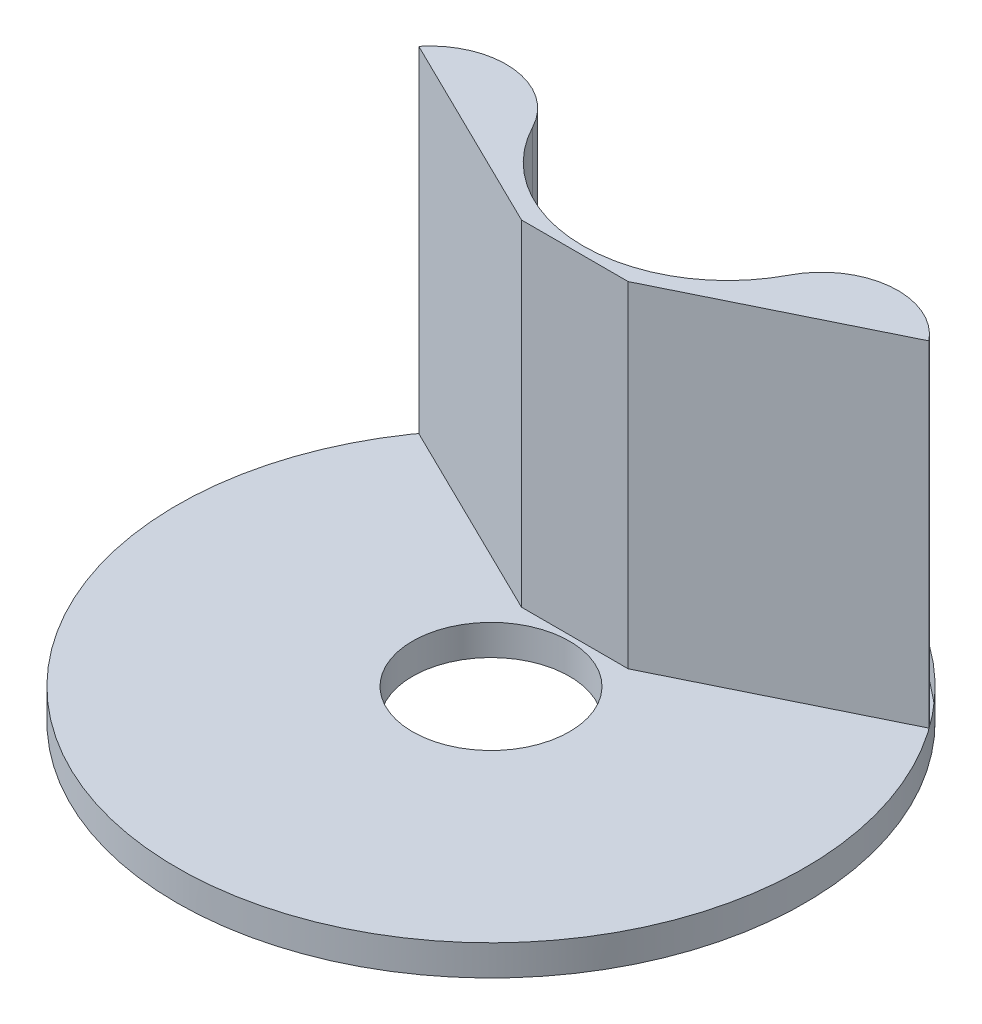
ISO-10303-21;
HEADER;
FILE_DESCRIPTION(('STEP AP214'),'2;1');
FILE_NAME('part.step','',(''),(''),'','','');
FILE_SCHEMA(('AUTOMOTIVE_DESIGN { 1 0 10303 214 1 1 1 1 }'));
ENDSEC;
DATA;
#1=APPLICATION_CONTEXT('core data for automotive mechanical design processes');
#2=APPLICATION_PROTOCOL_DEFINITION('international standard','automotive_design',2000,#1);
#3=PRODUCT_CONTEXT('',#1,'mechanical');
#4=PRODUCT('Part','Part','',(#3));
#5=PRODUCT_RELATED_PRODUCT_CATEGORY('part','',(#4));
#6=PRODUCT_DEFINITION_FORMATION('','',#4);
#7=PRODUCT_DEFINITION_CONTEXT('part definition',#1,'design');
#8=PRODUCT_DEFINITION('design','',#6,#7);
#9=PRODUCT_DEFINITION_SHAPE('','',#8);
#10=(LENGTH_UNIT() NAMED_UNIT(*) SI_UNIT(.MILLI.,.METRE.));
#11=(NAMED_UNIT(*) PLANE_ANGLE_UNIT() SI_UNIT($,.RADIAN.));
#12=(NAMED_UNIT(*) SI_UNIT($,.STERADIAN.) SOLID_ANGLE_UNIT());
#13=UNCERTAINTY_MEASURE_WITH_UNIT(LENGTH_MEASURE(1.E-05),#10,'distance_accuracy_value','');
#14=(GEOMETRIC_REPRESENTATION_CONTEXT(3) GLOBAL_UNCERTAINTY_ASSIGNED_CONTEXT((#13)) GLOBAL_UNIT_ASSIGNED_CONTEXT((#10,
#11,#12)) REPRESENTATION_CONTEXT('',''));
#15=CARTESIAN_POINT('',(0.,0.,0.));
#16=DIRECTION('',(0.,0.,1.));
#17=DIRECTION('',(1.,0.,0.));
#18=AXIS2_PLACEMENT_3D('',#15,#16,#17);
#19=CARTESIAN_POINT('',(0.,2.,0.));
#20=DIRECTION('',(0.,1.,0.));
#21=DIRECTION('',(0.,0.,1.));
#22=AXIS2_PLACEMENT_3D('',#19,#20,#21);
#23=PLANE('',#22);
#24=CARTESIAN_POINT('',(0.,2.,-13.));
#25=DIRECTION('',(0.,1.,0.));
#26=DIRECTION('',(0.,0.,1.));
#27=AXIS2_PLACEMENT_3D('',#24,#25,#26);
#28=CIRCLE('',#27,6.5);
#29=CARTESIAN_POINT('',(0.,2.,-6.5));
#30=VERTEX_POINT('',#29);
#31=EDGE_CURVE('E113',#30,#30,#28,.T.);
#32=ORIENTED_EDGE('',*,*,#31,.F.);
#33=EDGE_LOOP('',(#32));
#34=FACE_BOUND('',#33,.T.);
#35=CARTESIAN_POINT('',(0.,2.,0.));
#36=DIRECTION('',(0.,1.,0.));
#37=DIRECTION('',(0.,0.,1.));
#38=AXIS2_PLACEMENT_3D('',#35,#36,#37);
#39=CIRCLE('',#38,20.6);
#40=CARTESIAN_POINT('',(16.970524527272,2.,-11.6773840079557));
#41=VERTEX_POINT('',#40);
#42=CARTESIAN_POINT('',(-16.970524527272,2.,-11.6773840079557));
#43=VERTEX_POINT('',#42);
#44=EDGE_CURVE('E163',#41,#43,#39,.T.);
#45=ORIENTED_EDGE('',*,*,#44,.T.);
#46=CARTESIAN_POINT('',(-12.8514651759924,2.,-8.84306750117036));
#47=DIRECTION('',(0.,1.,0.));
#48=DIRECTION('',(0.,0.,1.));
#49=AXIS2_PLACEMENT_3D('',#46,#47,#48);
#50=CIRCLE('',#49,5.);
#51=CARTESIAN_POINT('',(-16.7331271257797,2.,-11.9946862134471));
#52=VERTEX_POINT('',#51);
#53=EDGE_CURVE('E179',#52,#43,#50,.T.);
#54=ORIENTED_EDGE('',*,*,#53,.F.);
#55=CARTESIAN_POINT('',(-12.8514651759924,2.,-8.84306750117036));
#56=DIRECTION('',(0.,1.,0.));
#57=DIRECTION('',(0.,0.,1.));
#58=AXIS2_PLACEMENT_3D('',#55,#56,#57);
#59=CIRCLE('',#58,5.);
#60=CARTESIAN_POINT('',(-8.41592587564528,2.,-11.1508783935696));
#61=VERTEX_POINT('',#60);
#62=EDGE_CURVE('E11',#52,#61,#59,.F.);
#63=ORIENTED_EDGE('',*,*,#62,.T.);
#64=CARTESIAN_POINT('',(0.,2.,-15.5296842366197));
#65=DIRECTION('',(0.,1.,0.));
#66=DIRECTION('',(0.,0.,1.));
#67=AXIS2_PLACEMENT_3D('',#64,#65,#66);
#68=CIRCLE('',#67,9.48692515810502);
#69=CARTESIAN_POINT('',(8.41592587564528,2.,-11.1508783935696));
#70=VERTEX_POINT('',#69);
#71=EDGE_CURVE('E134',#61,#70,#68,.T.);
#72=ORIENTED_EDGE('',*,*,#71,.T.);
#73=CARTESIAN_POINT('',(12.8514651759924,2.,-8.84306750117036));
#74=DIRECTION('',(0.,1.,0.));
#75=DIRECTION('',(0.,0.,1.));
#76=AXIS2_PLACEMENT_3D('',#73,#74,#75);
#77=CIRCLE('',#76,5.);
#78=CARTESIAN_POINT('',(16.7331271257797,2.,-11.9946862134471));
#79=VERTEX_POINT('',#78);
#80=EDGE_CURVE('E50',#70,#79,#77,.F.);
#81=ORIENTED_EDGE('',*,*,#80,.T.);
#82=CARTESIAN_POINT('',(12.8514651759924,2.,-8.84306750117036));
#83=DIRECTION('',(0.,1.,0.));
#84=DIRECTION('',(0.,0.,1.));
#85=AXIS2_PLACEMENT_3D('',#82,#83,#84);
#86=CIRCLE('',#85,5.);
#87=EDGE_CURVE('E183',#41,#79,#86,.T.);
#88=ORIENTED_EDGE('',*,*,#87,.F.);
#89=EDGE_LOOP('',(#45,#54,#63,#72,#81,#88));
#90=FACE_BOUND('',#89,.T.);
#91=ADVANCED_FACE('F41',(#34,#90),#23,.T.);
#92=CARTESIAN_POINT('',(0.,2.,0.));
#93=DIRECTION('',(0.,-1.,0.));
#94=DIRECTION('',(0.,0.,-1.));
#95=AXIS2_PLACEMENT_3D('',#92,#93,#94);
#96=CYLINDRICAL_SURFACE('',#95,20.6);
#97=ORIENTED_EDGE('',*,*,#44,.F.);
#98=EDGE_CURVE('E159',#43,#41,#39,.T.);
#99=ORIENTED_EDGE('',*,*,#98,.F.);
#100=EDGE_LOOP('',(#97,#99));
#101=FACE_BOUND('',#100,.T.);
#102=CARTESIAN_POINT('',(0.,0.,0.));
#103=DIRECTION('',(0.,1.,0.));
#104=DIRECTION('',(0.,0.,1.));
#105=AXIS2_PLACEMENT_3D('',#102,#103,#104);
#106=CIRCLE('',#105,20.6);
#107=CARTESIAN_POINT('',(0.,0.,20.6));
#108=VERTEX_POINT('',#107);
#109=EDGE_CURVE('E164',#108,#108,#106,.T.);
#110=ORIENTED_EDGE('',*,*,#109,.T.);
#111=EDGE_LOOP('',(#110));
#112=FACE_BOUND('',#111,.T.);
#113=ADVANCED_FACE('F216',(#101,#112),#96,.T.);
#114=ORIENTED_EDGE('',*,*,#98,.T.);
#115=ORIENTED_EDGE('',*,*,#87,.T.);
#116=DIRECTION('',(0.897709903987118,0.,-0.440587026912322));
#117=VECTOR('',#116,1.);
#118=CARTESIAN_POINT('',(-1.49594710795883,2.,-3.04803921274508));
#119=LINE('',#118,#117);
#120=CARTESIAN_POINT('',(3.5,2.,-5.5));
#121=VERTEX_POINT('',#120);
#122=EDGE_CURVE('E129',#121,#79,#119,.T.);
#123=ORIENTED_EDGE('',*,*,#122,.F.);
#124=DIRECTION('',(1.,0.,0.));
#125=VECTOR('',#124,1.);
#126=CARTESIAN_POINT('',(0.,2.,-5.5));
#127=LINE('',#126,#125);
#128=CARTESIAN_POINT('',(-3.5,2.,-5.5));
#129=VERTEX_POINT('',#128);
#130=EDGE_CURVE('E140',#129,#121,#127,.T.);
#131=ORIENTED_EDGE('',*,*,#130,.F.);
#132=DIRECTION('',(-0.897709903987118,0.,-0.440587026912322));
#133=VECTOR('',#132,1.);
#134=CARTESIAN_POINT('',(1.49594710795883,2.,-3.04803921274508));
#135=LINE('',#134,#133);
#136=EDGE_CURVE('E109',#129,#52,#135,.T.);
#137=ORIENTED_EDGE('',*,*,#136,.T.);
#138=ORIENTED_EDGE('',*,*,#53,.T.);
#139=EDGE_LOOP('',(#114,#115,#123,#131,#137,#138));
#140=FACE_BOUND('',#139,.T.);
#141=CARTESIAN_POINT('',(0.,2.,0.));
#142=DIRECTION('',(0.,1.,0.));
#143=DIRECTION('',(0.,0.,1.));
#144=AXIS2_PLACEMENT_3D('',#141,#142,#143);
#145=CIRCLE('',#144,5.15);
#146=CARTESIAN_POINT('',(0.,2.,5.15));
#147=VERTEX_POINT('',#146);
#148=EDGE_CURVE('E151',#147,#147,#145,.T.);
#149=ORIENTED_EDGE('',*,*,#148,.F.);
#150=EDGE_LOOP('',(#149));
#151=FACE_BOUND('',#150,.T.);
#152=ADVANCED_FACE('F204',(#140,#151),#23,.T.);
#153=CARTESIAN_POINT('',(0.,0.,0.));
#154=DIRECTION('',(0.,1.,0.));
#155=DIRECTION('',(0.,0.,1.));
#156=AXIS2_PLACEMENT_3D('',#153,#154,#155);
#157=PLANE('',#156);
#158=CARTESIAN_POINT('',(0.,0.,-13.));
#159=DIRECTION('',(0.,1.,0.));
#160=DIRECTION('',(0.,0.,1.));
#161=AXIS2_PLACEMENT_3D('',#158,#159,#160);
#162=CIRCLE('',#161,6.5);
#163=CARTESIAN_POINT('',(0.,0.,-6.5));
#164=VERTEX_POINT('',#163);
#165=EDGE_CURVE('E147',#164,#164,#162,.T.);
#166=ORIENTED_EDGE('',*,*,#165,.T.);
#167=EDGE_LOOP('',(#166));
#168=FACE_BOUND('',#167,.T.);
#169=CARTESIAN_POINT('',(0.,0.,0.));
#170=DIRECTION('',(0.,1.,0.));
#171=DIRECTION('',(0.,0.,1.));
#172=AXIS2_PLACEMENT_3D('',#169,#170,#171);
#173=CIRCLE('',#172,5.15);
#174=CARTESIAN_POINT('',(0.,0.,5.15));
#175=VERTEX_POINT('',#174);
#176=EDGE_CURVE('E158',#175,#175,#173,.T.);
#177=ORIENTED_EDGE('',*,*,#176,.T.);
#178=EDGE_LOOP('',(#177));
#179=FACE_BOUND('',#178,.T.);
#180=ORIENTED_EDGE('',*,*,#109,.F.);
#181=EDGE_LOOP('',(#180));
#182=FACE_BOUND('',#181,.T.);
#183=ADVANCED_FACE('F223',(#168,#179,#182),#157,.F.);
#184=CARTESIAN_POINT('',(0.,-1.,0.));
#185=DIRECTION('',(0.,1.,0.));
#186=DIRECTION('',(0.,0.,1.));
#187=AXIS2_PLACEMENT_3D('',#184,#185,#186);
#188=CYLINDRICAL_SURFACE('',#187,5.15);
#189=ORIENTED_EDGE('',*,*,#148,.T.);
#190=EDGE_LOOP('',(#189));
#191=FACE_BOUND('',#190,.T.);
#192=ORIENTED_EDGE('',*,*,#176,.F.);
#193=EDGE_LOOP('',(#192));
#194=FACE_BOUND('',#193,.T.);
#195=ADVANCED_FACE('F225',(#191,#194),#188,.F.);
#196=CARTESIAN_POINT('',(0.,0.,-13.));
#197=DIRECTION('',(0.,1.,0.));
#198=DIRECTION('',(0.,0.,1.));
#199=AXIS2_PLACEMENT_3D('',#196,#197,#198);
#200=CYLINDRICAL_SURFACE('',#199,6.5);
#201=ORIENTED_EDGE('',*,*,#165,.F.);
#202=EDGE_LOOP('',(#201));
#203=FACE_BOUND('',#202,.T.);
#204=ORIENTED_EDGE('',*,*,#31,.T.);
#205=EDGE_LOOP('',(#204));
#206=FACE_BOUND('',#205,.T.);
#207=ADVANCED_FACE('F232',(#203,#206),#200,.F.);
#208=CARTESIAN_POINT('',(0.,24.,-15.5296842366197));
#209=DIRECTION('',(0.,-1.,0.));
#210=DIRECTION('',(0.,0.,-1.));
#211=AXIS2_PLACEMENT_3D('',#208,#209,#210);
#212=CYLINDRICAL_SURFACE('',#211,9.48692515810502);
#213=CARTESIAN_POINT('',(0.,24.,-15.5296842366197));
#214=DIRECTION('',(0.,1.,0.));
#215=DIRECTION('',(0.,0.,1.));
#216=AXIS2_PLACEMENT_3D('',#213,#214,#215);
#217=CIRCLE('',#216,9.48692515810502);
#218=CARTESIAN_POINT('',(-8.41592587564528,24.,-11.1508783935696));
#219=VERTEX_POINT('',#218);
#220=CARTESIAN_POINT('',(8.41592587564528,24.,-11.1508783935696));
#221=VERTEX_POINT('',#220);
#222=EDGE_CURVE('E125',#219,#221,#217,.T.);
#223=ORIENTED_EDGE('',*,*,#222,.T.);
#224=DIRECTION('',(0.,-1.,0.));
#225=VECTOR('',#224,1.);
#226=CARTESIAN_POINT('',(8.41592587564528,24.,-11.1508783935696));
#227=LINE('',#226,#225);
#228=EDGE_CURVE('E175',#221,#70,#227,.T.);
#229=ORIENTED_EDGE('',*,*,#228,.T.);
#230=ORIENTED_EDGE('',*,*,#71,.F.);
#231=DIRECTION('',(0.,-1.,0.));
#232=VECTOR('',#231,1.);
#233=CARTESIAN_POINT('',(-8.41592587564528,24.,-11.1508783935696));
#234=LINE('',#233,#232);
#235=EDGE_CURVE('E171',#61,#219,#234,.F.);
#236=ORIENTED_EDGE('',*,*,#235,.T.);
#237=EDGE_LOOP('',(#223,#229,#230,#236));
#238=FACE_BOUND('',#237,.T.);
#239=ADVANCED_FACE('F211',(#238),#212,.F.);
#240=CARTESIAN_POINT('',(1.49594710795883,24.,-3.04803921274508));
#241=DIRECTION('',(-0.440587026912321,0.,0.897709903987118));
#242=DIRECTION('',(0.897709903987118,0.,0.440587026912321));
#243=AXIS2_PLACEMENT_3D('',#240,#241,#242);
#244=PLANE('',#243);
#245=DIRECTION('',(-0.897709903987118,0.,-0.440587026912322));
#246=VECTOR('',#245,1.);
#247=CARTESIAN_POINT('',(1.49594710795883,24.,-3.04803921274508));
#248=LINE('',#247,#246);
#249=CARTESIAN_POINT('',(-3.5,24.,-5.5));
#250=VERTEX_POINT('',#249);
#251=CARTESIAN_POINT('',(-16.7331271257797,24.,-11.9946862134471));
#252=VERTEX_POINT('',#251);
#253=EDGE_CURVE('E106',#250,#252,#248,.T.);
#254=ORIENTED_EDGE('',*,*,#253,.T.);
#255=DIRECTION('',(0.,1.,0.));
#256=VECTOR('',#255,1.);
#257=CARTESIAN_POINT('',(-16.7331271257797,24.,-11.9946862134471));
#258=LINE('',#257,#256);
#259=EDGE_CURVE('E194',#252,#52,#258,.F.);
#260=ORIENTED_EDGE('',*,*,#259,.T.);
#261=ORIENTED_EDGE('',*,*,#136,.F.);
#262=DIRECTION('',(0.,-1.,0.));
#263=VECTOR('',#262,1.);
#264=CARTESIAN_POINT('',(-3.5,24.,-5.5));
#265=LINE('',#264,#263);
#266=EDGE_CURVE('E102',#250,#129,#265,.T.);
#267=ORIENTED_EDGE('',*,*,#266,.F.);
#268=EDGE_LOOP('',(#254,#260,#261,#267));
#269=FACE_BOUND('',#268,.T.);
#270=ADVANCED_FACE('F104',(#269),#244,.T.);
#271=CARTESIAN_POINT('',(0.,24.,-5.5));
#272=DIRECTION('',(0.,0.,-1.));
#273=DIRECTION('',(-1.,0.,0.));
#274=AXIS2_PLACEMENT_3D('',#271,#272,#273);
#275=PLANE('',#274);
#276=ORIENTED_EDGE('',*,*,#130,.T.);
#277=DIRECTION('',(0.,-1.,0.));
#278=VECTOR('',#277,1.);
#279=CARTESIAN_POINT('',(3.5,24.,-5.5));
#280=LINE('',#279,#278);
#281=CARTESIAN_POINT('',(3.5,24.,-5.5));
#282=VERTEX_POINT('',#281);
#283=EDGE_CURVE('E114',#282,#121,#280,.T.);
#284=ORIENTED_EDGE('',*,*,#283,.F.);
#285=DIRECTION('',(1.,0.,0.));
#286=VECTOR('',#285,1.);
#287=CARTESIAN_POINT('',(0.,24.,-5.5));
#288=LINE('',#287,#286);
#289=EDGE_CURVE('E117',#250,#282,#288,.T.);
#290=ORIENTED_EDGE('',*,*,#289,.F.);
#291=ORIENTED_EDGE('',*,*,#266,.T.);
#292=EDGE_LOOP('',(#276,#284,#290,#291));
#293=FACE_BOUND('',#292,.T.);
#294=ADVANCED_FACE('F118',(#293),#275,.F.);
#295=CARTESIAN_POINT('',(-1.49594710795883,24.,-3.04803921274508));
#296=DIRECTION('',(-0.440587026912321,0.,-0.897709903987118));
#297=DIRECTION('',(-0.897709903987118,0.,0.440587026912321));
#298=AXIS2_PLACEMENT_3D('',#295,#296,#297);
#299=PLANE('',#298);
#300=ORIENTED_EDGE('',*,*,#122,.T.);
#301=DIRECTION('',(0.,1.,0.));
#302=VECTOR('',#301,1.);
#303=CARTESIAN_POINT('',(16.7331271257797,2.,-11.9946862134471));
#304=LINE('',#303,#302);
#305=CARTESIAN_POINT('',(16.7331271257797,24.,-11.9946862134471));
#306=VERTEX_POINT('',#305);
#307=EDGE_CURVE('E65',#79,#306,#304,.T.);
#308=ORIENTED_EDGE('',*,*,#307,.T.);
#309=DIRECTION('',(0.897709903987118,0.,-0.440587026912322));
#310=VECTOR('',#309,1.);
#311=CARTESIAN_POINT('',(-1.49594710795883,24.,-3.04803921274508));
#312=LINE('',#311,#310);
#313=EDGE_CURVE('E121',#282,#306,#312,.T.);
#314=ORIENTED_EDGE('',*,*,#313,.F.);
#315=ORIENTED_EDGE('',*,*,#283,.T.);
#316=EDGE_LOOP('',(#300,#308,#314,#315));
#317=FACE_BOUND('',#316,.T.);
#318=ADVANCED_FACE('F207',(#317),#299,.F.);
#319=CARTESIAN_POINT('',(0.,24.,0.));
#320=DIRECTION('',(0.,1.,0.));
#321=DIRECTION('',(0.,0.,1.));
#322=AXIS2_PLACEMENT_3D('',#319,#320,#321);
#323=PLANE('',#322);
#324=ORIENTED_EDGE('',*,*,#313,.T.);
#325=CARTESIAN_POINT('',(12.8514651759924,24.,-8.84306750117036));
#326=DIRECTION('',(0.,1.,0.));
#327=DIRECTION('',(0.,0.,1.));
#328=AXIS2_PLACEMENT_3D('',#325,#326,#327);
#329=CIRCLE('',#328,5.);
#330=EDGE_CURVE('E191',#306,#221,#329,.T.);
#331=ORIENTED_EDGE('',*,*,#330,.T.);
#332=ORIENTED_EDGE('',*,*,#222,.F.);
#333=CARTESIAN_POINT('',(-12.8514651759924,24.,-8.84306750117036));
#334=DIRECTION('',(0.,1.,0.));
#335=DIRECTION('',(0.,0.,1.));
#336=AXIS2_PLACEMENT_3D('',#333,#334,#335);
#337=CIRCLE('',#336,5.);
#338=EDGE_CURVE('E57',#219,#252,#337,.T.);
#339=ORIENTED_EDGE('',*,*,#338,.T.);
#340=ORIENTED_EDGE('',*,*,#253,.F.);
#341=ORIENTED_EDGE('',*,*,#289,.T.);
#342=EDGE_LOOP('',(#324,#331,#332,#339,#340,#341));
#343=FACE_BOUND('',#342,.T.);
#344=ADVANCED_FACE('F123',(#343),#323,.T.);
#345=CARTESIAN_POINT('',(12.8514651759924,2.,-8.84306750117036));
#346=DIRECTION('',(0.,1.,0.));
#347=DIRECTION('',(0.,0.,1.));
#348=AXIS2_PLACEMENT_3D('',#345,#346,#347);
#349=CYLINDRICAL_SURFACE('',#348,5.);
#350=ORIENTED_EDGE('',*,*,#307,.F.);
#351=ORIENTED_EDGE('',*,*,#80,.F.);
#352=ORIENTED_EDGE('',*,*,#228,.F.);
#353=ORIENTED_EDGE('',*,*,#330,.F.);
#354=EDGE_LOOP('',(#350,#351,#352,#353));
#355=FACE_BOUND('',#354,.T.);
#356=ADVANCED_FACE('F209',(#355),#349,.T.);
#357=CARTESIAN_POINT('',(-12.8514651759924,24.,-8.84306750117036));
#358=DIRECTION('',(0.,1.,0.));
#359=DIRECTION('',(0.,0.,1.));
#360=AXIS2_PLACEMENT_3D('',#357,#358,#359);
#361=CYLINDRICAL_SURFACE('',#360,5.);
#362=ORIENTED_EDGE('',*,*,#338,.F.);
#363=ORIENTED_EDGE('',*,*,#235,.F.);
#364=ORIENTED_EDGE('',*,*,#62,.F.);
#365=ORIENTED_EDGE('',*,*,#259,.F.);
#366=EDGE_LOOP('',(#362,#363,#364,#365));
#367=FACE_BOUND('',#366,.T.);
#368=ADVANCED_FACE('F43',(#367),#361,.T.);
#369=CLOSED_SHELL('',(#91,#113,#152,#183,#195,#207,#239,#270,#294,#318,#344,#356,#368));
#370=MANIFOLD_SOLID_BREP('B2',#369);
#371=ADVANCED_BREP_SHAPE_REPRESENTATION('',(#18,#370),#14);
#372=SHAPE_DEFINITION_REPRESENTATION(#9,#371);
ENDSEC;
END-ISO-10303-21;
